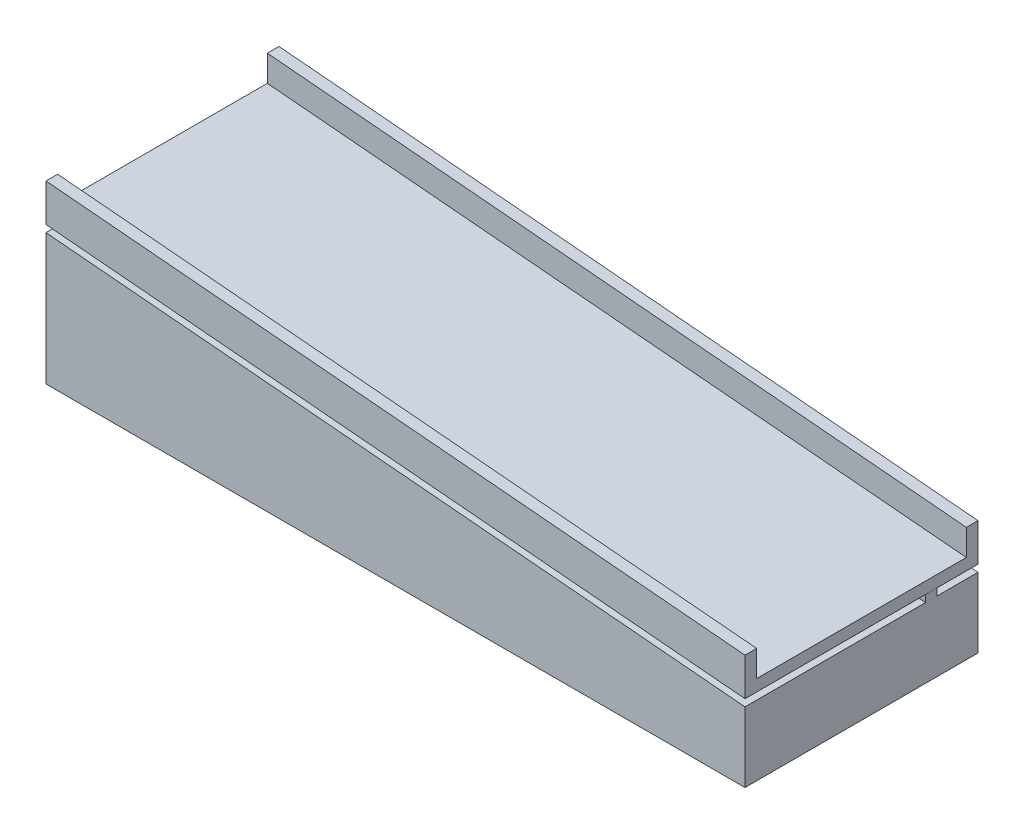
ISO-10303-21;
HEADER;
FILE_DESCRIPTION(('STEP AP214'),'2;1');
FILE_NAME('part.step','',(''),(''),'','','');
FILE_SCHEMA(('AUTOMOTIVE_DESIGN { 1 0 10303 214 1 1 1 1 }'));
ENDSEC;
DATA;
#1=APPLICATION_CONTEXT('core data for automotive mechanical design processes');
#2=APPLICATION_PROTOCOL_DEFINITION('international standard','automotive_design',2000,#1);
#3=PRODUCT_CONTEXT('',#1,'mechanical');
#4=PRODUCT('Part','Part','',(#3));
#5=PRODUCT_RELATED_PRODUCT_CATEGORY('part','',(#4));
#6=PRODUCT_DEFINITION_FORMATION('','',#4);
#7=PRODUCT_DEFINITION_CONTEXT('part definition',#1,'design');
#8=PRODUCT_DEFINITION('design','',#6,#7);
#9=PRODUCT_DEFINITION_SHAPE('','',#8);
#10=(LENGTH_UNIT() NAMED_UNIT(*) SI_UNIT(.MILLI.,.METRE.));
#11=(NAMED_UNIT(*) PLANE_ANGLE_UNIT() SI_UNIT($,.RADIAN.));
#12=(NAMED_UNIT(*) SI_UNIT($,.STERADIAN.) SOLID_ANGLE_UNIT());
#13=UNCERTAINTY_MEASURE_WITH_UNIT(LENGTH_MEASURE(1.E-05),#10,'distance_accuracy_value','');
#14=(GEOMETRIC_REPRESENTATION_CONTEXT(3) GLOBAL_UNCERTAINTY_ASSIGNED_CONTEXT((#13)) GLOBAL_UNIT_ASSIGNED_CONTEXT((#10,
#11,#12)) REPRESENTATION_CONTEXT('',''));
#15=CARTESIAN_POINT('',(0.,0.,0.));
#16=DIRECTION('',(0.,0.,1.));
#17=DIRECTION('',(1.,0.,0.));
#18=AXIS2_PLACEMENT_3D('',#15,#16,#17);
#19=CARTESIAN_POINT('',(0.,0.,0.));
#20=DIRECTION('',(1.,0.,0.));
#21=DIRECTION('',(0.,0.,-1.));
#22=AXIS2_PLACEMENT_3D('',#19,#20,#21);
#23=PLANE('',#22);
#24=DIRECTION('',(0.,-1.,0.));
#25=VECTOR('',#24,1.);
#26=CARTESIAN_POINT('',(0.,59.2577659597685,0.));
#27=LINE('',#26,#25);
#28=CARTESIAN_POINT('',(0.,75.4577060547774,0.));
#29=VERTEX_POINT('',#28);
#30=CARTESIAN_POINT('',(0.,59.2577659597685,0.));
#31=VERTEX_POINT('',#30);
#32=EDGE_CURVE('E84',#29,#31,#27,.T.);
#33=ORIENTED_EDGE('',*,*,#32,.T.);
#34=DIRECTION('',(0.,0.,1.));
#35=VECTOR('',#34,1.);
#36=CARTESIAN_POINT('',(0.,59.2577659597685,0.));
#37=LINE('',#36,#35);
#38=CARTESIAN_POINT('',(0.,59.2577659597685,100.));
#39=VERTEX_POINT('',#38);
#40=EDGE_CURVE('E78',#31,#39,#37,.T.);
#41=ORIENTED_EDGE('',*,*,#40,.T.);
#42=DIRECTION('',(0.,1.,0.));
#43=VECTOR('',#42,1.);
#44=CARTESIAN_POINT('',(0.,59.2577659597685,100.));
#45=LINE('',#44,#43);
#46=CARTESIAN_POINT('',(0.,75.4577060547774,100.));
#47=VERTEX_POINT('',#46);
#48=EDGE_CURVE('E119',#39,#47,#45,.T.);
#49=ORIENTED_EDGE('',*,*,#48,.T.);
#50=DIRECTION('',(0.,0.,-1.));
#51=VECTOR('',#50,1.);
#52=CARTESIAN_POINT('',(0.,75.4577060547774,95.));
#53=LINE('',#52,#51);
#54=CARTESIAN_POINT('',(0.,75.4577060547774,95.));
#55=VERTEX_POINT('',#54);
#56=EDGE_CURVE('E126',#47,#55,#53,.T.);
#57=ORIENTED_EDGE('',*,*,#56,.T.);
#58=DIRECTION('',(0.,-1.,0.));
#59=VECTOR('',#58,1.);
#60=CARTESIAN_POINT('',(0.,75.4577060547774,95.));
#61=LINE('',#60,#59);
#62=CARTESIAN_POINT('',(0.,64.2577659597685,95.));
#63=VERTEX_POINT('',#62);
#64=EDGE_CURVE('E136',#55,#63,#61,.T.);
#65=ORIENTED_EDGE('',*,*,#64,.T.);
#66=DIRECTION('',(0.,0.,-1.));
#67=VECTOR('',#66,1.);
#68=CARTESIAN_POINT('',(0.,64.2577659597685,5.));
#69=LINE('',#68,#67);
#70=CARTESIAN_POINT('',(0.,64.2577659597685,5.));
#71=VERTEX_POINT('',#70);
#72=EDGE_CURVE('E145',#63,#71,#69,.T.);
#73=ORIENTED_EDGE('',*,*,#72,.T.);
#74=DIRECTION('',(0.,1.,0.));
#75=VECTOR('',#74,1.);
#76=CARTESIAN_POINT('',(0.,75.4577060547774,5.));
#77=LINE('',#76,#75);
#78=CARTESIAN_POINT('',(0.,75.4577060547774,5.));
#79=VERTEX_POINT('',#78);
#80=EDGE_CURVE('E153',#71,#79,#77,.T.);
#81=ORIENTED_EDGE('',*,*,#80,.T.);
#82=DIRECTION('',(0.,0.,-1.));
#83=VECTOR('',#82,1.);
#84=CARTESIAN_POINT('',(0.,75.4577060547774,0.));
#85=LINE('',#84,#83);
#86=EDGE_CURVE('E89',#79,#29,#85,.T.);
#87=ORIENTED_EDGE('',*,*,#86,.T.);
#88=EDGE_LOOP('',(#33,#41,#49,#57,#65,#73,#81,#87));
#89=FACE_BOUND('',#88,.T.);
#90=ADVANCED_FACE('F42',(#89),#23,.F.);
#91=CARTESIAN_POINT('',(300.,-26.246599057775,0.));
#92=DIRECTION('',(1.,0.,0.));
#93=DIRECTION('',(0.,0.,-1.));
#94=AXIS2_PLACEMENT_3D('',#91,#92,#93);
#95=PLANE('',#94);
#96=DIRECTION('',(0.,-1.,0.));
#97=VECTOR('',#96,1.);
#98=CARTESIAN_POINT('',(300.,33.0111669019935,0.));
#99=LINE('',#98,#97);
#100=CARTESIAN_POINT('',(300.,49.2111069970024,0.));
#101=VERTEX_POINT('',#100);
#102=CARTESIAN_POINT('',(300.,33.0111669019935,0.));
#103=VERTEX_POINT('',#102);
#104=EDGE_CURVE('E56',#101,#103,#99,.T.);
#105=ORIENTED_EDGE('',*,*,#104,.F.);
#106=DIRECTION('',(0.,0.,-1.));
#107=VECTOR('',#106,1.);
#108=CARTESIAN_POINT('',(300.,49.2111069970024,0.));
#109=LINE('',#108,#107);
#110=CARTESIAN_POINT('',(300.,49.2111069970024,5.));
#111=VERTEX_POINT('',#110);
#112=EDGE_CURVE('E65',#111,#101,#109,.T.);
#113=ORIENTED_EDGE('',*,*,#112,.F.);
#114=DIRECTION('',(0.,1.,0.));
#115=VECTOR('',#114,1.);
#116=CARTESIAN_POINT('',(300.,49.2111069970024,5.));
#117=LINE('',#116,#115);
#118=CARTESIAN_POINT('',(300.,38.0111669019935,5.));
#119=VERTEX_POINT('',#118);
#120=EDGE_CURVE('E158',#119,#111,#117,.T.);
#121=ORIENTED_EDGE('',*,*,#120,.F.);
#122=DIRECTION('',(0.,0.,-1.));
#123=VECTOR('',#122,1.);
#124=CARTESIAN_POINT('',(300.,38.0111669019935,5.));
#125=LINE('',#124,#123);
#126=CARTESIAN_POINT('',(300.,38.0111669019935,95.));
#127=VERTEX_POINT('',#126);
#128=EDGE_CURVE('E150',#127,#119,#125,.T.);
#129=ORIENTED_EDGE('',*,*,#128,.F.);
#130=DIRECTION('',(0.,-1.,0.));
#131=VECTOR('',#130,1.);
#132=CARTESIAN_POINT('',(300.,49.2111069970024,95.));
#133=LINE('',#132,#131);
#134=CARTESIAN_POINT('',(300.,49.2111069970024,95.));
#135=VERTEX_POINT('',#134);
#136=EDGE_CURVE('E142',#135,#127,#133,.T.);
#137=ORIENTED_EDGE('',*,*,#136,.F.);
#138=DIRECTION('',(0.,0.,-1.));
#139=VECTOR('',#138,1.);
#140=CARTESIAN_POINT('',(300.,49.2111069970024,95.));
#141=LINE('',#140,#139);
#142=CARTESIAN_POINT('',(300.,49.2111069970024,100.));
#143=VERTEX_POINT('',#142);
#144=EDGE_CURVE('E137',#143,#135,#141,.T.);
#145=ORIENTED_EDGE('',*,*,#144,.F.);
#146=DIRECTION('',(0.,1.,0.));
#147=VECTOR('',#146,1.);
#148=CARTESIAN_POINT('',(300.,33.0111669019935,100.));
#149=LINE('',#148,#147);
#150=CARTESIAN_POINT('',(300.,33.0111669019935,100.));
#151=VERTEX_POINT('',#150);
#152=EDGE_CURVE('E130',#151,#143,#149,.T.);
#153=ORIENTED_EDGE('',*,*,#152,.F.);
#154=DIRECTION('',(0.,0.,1.));
#155=VECTOR('',#154,1.);
#156=CARTESIAN_POINT('',(300.,33.0111669019935,0.));
#157=LINE('',#156,#155);
#158=EDGE_CURVE('E12',#103,#151,#157,.T.);
#159=ORIENTED_EDGE('',*,*,#158,.F.);
#160=EDGE_LOOP('',(#105,#113,#121,#129,#137,#145,#153,#159));
#161=FACE_BOUND('',#160,.T.);
#162=ADVANCED_FACE('F181',(#161),#95,.T.);
#163=CARTESIAN_POINT('',(0.,59.2577659597685,100.));
#164=DIRECTION('',(0.,0.,-1.));
#165=DIRECTION('',(-1.,0.,0.));
#166=AXIS2_PLACEMENT_3D('',#163,#164,#165);
#167=PLANE('',#166);
#168=DIRECTION('',(0.996194698091746,-0.0871557427476511,0.));
#169=VECTOR('',#168,1.);
#170=CARTESIAN_POINT('',(0.,75.4577060547774,100.));
#171=LINE('',#170,#169);
#172=EDGE_CURVE('E123',#47,#143,#171,.T.);
#173=ORIENTED_EDGE('',*,*,#172,.F.);
#174=ORIENTED_EDGE('',*,*,#48,.F.);
#175=DIRECTION('',(0.996194698091746,-0.0871557427476511,0.));
#176=VECTOR('',#175,1.);
#177=CARTESIAN_POINT('',(0.,59.2577659597685,100.));
#178=LINE('',#177,#176);
#179=EDGE_CURVE('E121',#39,#151,#178,.T.);
#180=ORIENTED_EDGE('',*,*,#179,.T.);
#181=ORIENTED_EDGE('',*,*,#152,.T.);
#182=EDGE_LOOP('',(#173,#174,#180,#181));
#183=FACE_BOUND('',#182,.T.);
#184=ADVANCED_FACE('F120',(#183),#167,.F.);
#185=CARTESIAN_POINT('',(0.,75.4577060547774,95.));
#186=DIRECTION('',(-0.0871557427476511,-0.996194698091746,0.));
#187=DIRECTION('',(0.996194698091746,-0.0871557427476511,0.));
#188=AXIS2_PLACEMENT_3D('',#185,#186,#187);
#189=PLANE('',#188);
#190=DIRECTION('',(0.996194698091746,-0.0871557427476511,0.));
#191=VECTOR('',#190,1.);
#192=CARTESIAN_POINT('',(0.,75.4577060547774,95.));
#193=LINE('',#192,#191);
#194=EDGE_CURVE('E139',#55,#135,#193,.T.);
#195=ORIENTED_EDGE('',*,*,#194,.F.);
#196=ORIENTED_EDGE('',*,*,#56,.F.);
#197=ORIENTED_EDGE('',*,*,#172,.T.);
#198=ORIENTED_EDGE('',*,*,#144,.T.);
#199=EDGE_LOOP('',(#195,#196,#197,#198));
#200=FACE_BOUND('',#199,.T.);
#201=ADVANCED_FACE('F188',(#200),#189,.F.);
#202=CARTESIAN_POINT('',(0.,75.4577060547774,95.));
#203=DIRECTION('',(0.,0.,1.));
#204=DIRECTION('',(1.,0.,0.));
#205=AXIS2_PLACEMENT_3D('',#202,#203,#204);
#206=PLANE('',#205);
#207=DIRECTION('',(0.996194698091746,-0.0871557427476511,0.));
#208=VECTOR('',#207,1.);
#209=CARTESIAN_POINT('',(0.,64.2577659597685,95.));
#210=LINE('',#209,#208);
#211=EDGE_CURVE('E147',#63,#127,#210,.T.);
#212=ORIENTED_EDGE('',*,*,#211,.F.);
#213=ORIENTED_EDGE('',*,*,#64,.F.);
#214=ORIENTED_EDGE('',*,*,#194,.T.);
#215=ORIENTED_EDGE('',*,*,#136,.T.);
#216=EDGE_LOOP('',(#212,#213,#214,#215));
#217=FACE_BOUND('',#216,.T.);
#218=ADVANCED_FACE('F199',(#217),#206,.F.);
#219=CARTESIAN_POINT('',(0.,64.2577659597685,5.));
#220=DIRECTION('',(-0.0871557427476511,-0.996194698091746,0.));
#221=DIRECTION('',(0.996194698091746,-0.0871557427476511,0.));
#222=AXIS2_PLACEMENT_3D('',#219,#220,#221);
#223=PLANE('',#222);
#224=DIRECTION('',(0.996194698091746,-0.0871557427476511,0.));
#225=VECTOR('',#224,1.);
#226=CARTESIAN_POINT('',(0.,64.2577659597685,5.));
#227=LINE('',#226,#225);
#228=EDGE_CURVE('E155',#71,#119,#227,.T.);
#229=ORIENTED_EDGE('',*,*,#228,.F.);
#230=ORIENTED_EDGE('',*,*,#72,.F.);
#231=ORIENTED_EDGE('',*,*,#211,.T.);
#232=ORIENTED_EDGE('',*,*,#128,.T.);
#233=EDGE_LOOP('',(#229,#230,#231,#232));
#234=FACE_BOUND('',#233,.T.);
#235=ADVANCED_FACE('F201',(#234),#223,.F.);
#236=CARTESIAN_POINT('',(0.,75.4577060547774,5.));
#237=DIRECTION('',(0.,0.,-1.));
#238=DIRECTION('',(-1.,0.,0.));
#239=AXIS2_PLACEMENT_3D('',#236,#237,#238);
#240=PLANE('',#239);
#241=DIRECTION('',(0.996194698091746,-0.0871557427476511,0.));
#242=VECTOR('',#241,1.);
#243=CARTESIAN_POINT('',(0.,75.4577060547774,5.));
#244=LINE('',#243,#242);
#245=EDGE_CURVE('E161',#79,#111,#244,.T.);
#246=ORIENTED_EDGE('',*,*,#245,.F.);
#247=ORIENTED_EDGE('',*,*,#80,.F.);
#248=ORIENTED_EDGE('',*,*,#228,.T.);
#249=ORIENTED_EDGE('',*,*,#120,.T.);
#250=EDGE_LOOP('',(#246,#247,#248,#249));
#251=FACE_BOUND('',#250,.T.);
#252=ADVANCED_FACE('F178',(#251),#240,.F.);
#253=CARTESIAN_POINT('',(0.,75.4577060547774,0.));
#254=DIRECTION('',(-0.0871557427476511,-0.996194698091746,0.));
#255=DIRECTION('',(0.996194698091746,-0.0871557427476511,0.));
#256=AXIS2_PLACEMENT_3D('',#253,#254,#255);
#257=PLANE('',#256);
#258=DIRECTION('',(0.996194698091746,-0.0871557427476511,0.));
#259=VECTOR('',#258,1.);
#260=CARTESIAN_POINT('',(0.,75.4577060547774,0.));
#261=LINE('',#260,#259);
#262=EDGE_CURVE('E165',#29,#101,#261,.T.);
#263=ORIENTED_EDGE('',*,*,#262,.F.);
#264=ORIENTED_EDGE('',*,*,#86,.F.);
#265=ORIENTED_EDGE('',*,*,#245,.T.);
#266=ORIENTED_EDGE('',*,*,#112,.T.);
#267=EDGE_LOOP('',(#263,#264,#265,#266));
#268=FACE_BOUND('',#267,.T.);
#269=ADVANCED_FACE('F171',(#268),#257,.F.);
#270=CARTESIAN_POINT('',(0.,59.2577659597685,0.));
#271=DIRECTION('',(0.,0.,1.));
#272=DIRECTION('',(1.,0.,0.));
#273=AXIS2_PLACEMENT_3D('',#270,#271,#272);
#274=PLANE('',#273);
#275=DIRECTION('',(0.996194698091746,-0.0871557427476511,0.));
#276=VECTOR('',#275,1.);
#277=CARTESIAN_POINT('',(0.,59.2577659597685,0.));
#278=LINE('',#277,#276);
#279=EDGE_CURVE('E49',#31,#103,#278,.T.);
#280=ORIENTED_EDGE('',*,*,#279,.F.);
#281=ORIENTED_EDGE('',*,*,#32,.F.);
#282=ORIENTED_EDGE('',*,*,#262,.T.);
#283=ORIENTED_EDGE('',*,*,#104,.T.);
#284=EDGE_LOOP('',(#280,#281,#282,#283));
#285=FACE_BOUND('',#284,.T.);
#286=ADVANCED_FACE('F169',(#285),#274,.F.);
#287=CARTESIAN_POINT('',(0.,59.2577659597685,0.));
#288=DIRECTION('',(0.0871557427476511,0.996194698091746,0.));
#289=DIRECTION('',(-0.996194698091746,0.0871557427476511,0.));
#290=AXIS2_PLACEMENT_3D('',#287,#288,#289);
#291=PLANE('',#290);
#292=ORIENTED_EDGE('',*,*,#158,.T.);
#293=ORIENTED_EDGE('',*,*,#179,.F.);
#294=ORIENTED_EDGE('',*,*,#40,.F.);
#295=ORIENTED_EDGE('',*,*,#279,.T.);
#296=EDGE_LOOP('',(#292,#293,#294,#295));
#297=FACE_BOUND('',#296,.T.);
#298=ADVANCED_FACE('F128',(#297),#291,.F.);
#299=CLOSED_SHELL('',(#90,#162,#184,#201,#218,#235,#252,#269,#286,#298));
#300=MANIFOLD_SOLID_BREP('B2',#299);
#301=CARTESIAN_POINT('',(0.,56.2465990577751,100.));
#302=DIRECTION('',(-0.0871557427476512,-0.996194698091746,0.));
#303=DIRECTION('',(0.996194698091746,-0.0871557427476512,0.));
#304=AXIS2_PLACEMENT_3D('',#301,#302,#303);
#305=PLANE('',#304);
#306=DIRECTION('',(0.996194698091746,-0.0871557427476512,0.));
#307=VECTOR('',#306,1.);
#308=CARTESIAN_POINT('',(0.,56.2465990577751,17.5));
#309=LINE('',#308,#307);
#310=CARTESIAN_POINT('',(0.,56.2465990577751,17.5));
#311=VERTEX_POINT('',#310);
#312=CARTESIAN_POINT('',(300.,30.,17.5));
#313=VERTEX_POINT('',#312);
#314=EDGE_CURVE('E391',#311,#313,#309,.T.);
#315=ORIENTED_EDGE('',*,*,#314,.T.);
#316=DIRECTION('',(0.,0.,-1.));
#317=VECTOR('',#316,1.);
#318=CARTESIAN_POINT('',(300.,30.,100.));
#319=LINE('',#318,#317);
#320=CARTESIAN_POINT('',(300.,30.,0.));
#321=VERTEX_POINT('',#320);
#322=EDGE_CURVE('E361',#313,#321,#319,.T.);
#323=ORIENTED_EDGE('',*,*,#322,.T.);
#324=DIRECTION('',(-0.996194698091746,0.0871557427476512,0.));
#325=VECTOR('',#324,1.);
#326=CARTESIAN_POINT('',(0.,56.2465990577751,0.));
#327=LINE('',#326,#325);
#328=CARTESIAN_POINT('',(0.,56.2465990577751,0.));
#329=VERTEX_POINT('',#328);
#330=EDGE_CURVE('E369',#321,#329,#327,.T.);
#331=ORIENTED_EDGE('',*,*,#330,.T.);
#332=DIRECTION('',(0.,0.,-1.));
#333=VECTOR('',#332,1.);
#334=CARTESIAN_POINT('',(0.,56.2465990577751,100.));
#335=LINE('',#334,#333);
#336=EDGE_CURVE('E362',#311,#329,#335,.T.);
#337=ORIENTED_EDGE('',*,*,#336,.F.);
#338=EDGE_LOOP('',(#315,#323,#331,#337));
#339=FACE_BOUND('',#338,.T.);
#340=ADVANCED_FACE('F269',(#339),#305,.F.);
#341=CARTESIAN_POINT('',(300.,0.,100.));
#342=DIRECTION('',(0.,1.,0.));
#343=DIRECTION('',(-1.,0.,0.));
#344=AXIS2_PLACEMENT_3D('',#341,#342,#343);
#345=PLANE('',#344);
#346=DIRECTION('',(1.,0.,0.));
#347=VECTOR('',#346,1.);
#348=CARTESIAN_POINT('',(300.,0.,0.));
#349=LINE('',#348,#347);
#350=CARTESIAN_POINT('',(0.,0.,0.));
#351=VERTEX_POINT('',#350);
#352=CARTESIAN_POINT('',(300.,0.,0.));
#353=VERTEX_POINT('',#352);
#354=EDGE_CURVE('E375',#351,#353,#349,.T.);
#355=ORIENTED_EDGE('',*,*,#354,.T.);
#356=DIRECTION('',(0.,0.,-1.));
#357=VECTOR('',#356,1.);
#358=CARTESIAN_POINT('',(300.,0.,100.));
#359=LINE('',#358,#357);
#360=CARTESIAN_POINT('',(300.,0.,100.));
#361=VERTEX_POINT('',#360);
#362=EDGE_CURVE('E40',#361,#353,#359,.T.);
#363=ORIENTED_EDGE('',*,*,#362,.F.);
#364=DIRECTION('',(1.,0.,0.));
#365=VECTOR('',#364,1.);
#366=CARTESIAN_POINT('',(300.,0.,100.));
#367=LINE('',#366,#365);
#368=CARTESIAN_POINT('',(0.,0.,100.));
#369=VERTEX_POINT('',#368);
#370=EDGE_CURVE('E368',#369,#361,#367,.T.);
#371=ORIENTED_EDGE('',*,*,#370,.F.);
#372=DIRECTION('',(0.,0.,-1.));
#373=VECTOR('',#372,1.);
#374=CARTESIAN_POINT('',(0.,0.,100.));
#375=LINE('',#374,#373);
#376=EDGE_CURVE('E364',#369,#351,#375,.T.);
#377=ORIENTED_EDGE('',*,*,#376,.T.);
#378=EDGE_LOOP('',(#355,#363,#371,#377));
#379=FACE_BOUND('',#378,.T.);
#380=ADVANCED_FACE('F271',(#379),#345,.F.);
#381=CARTESIAN_POINT('',(300.,30.,100.));
#382=DIRECTION('',(-1.,0.,0.));
#383=DIRECTION('',(0.,0.,1.));
#384=AXIS2_PLACEMENT_3D('',#381,#382,#383);
#385=PLANE('',#384);
#386=DIRECTION('',(0.,1.,0.));
#387=VECTOR('',#386,1.);
#388=CARTESIAN_POINT('',(300.,30.,0.));
#389=LINE('',#388,#387);
#390=EDGE_CURVE('E372',#353,#321,#389,.T.);
#391=ORIENTED_EDGE('',*,*,#390,.T.);
#392=ORIENTED_EDGE('',*,*,#322,.F.);
#393=DIRECTION('',(0.,1.,0.));
#394=VECTOR('',#393,1.);
#395=CARTESIAN_POINT('',(300.,30.,17.5));
#396=LINE('',#395,#394);
#397=CARTESIAN_POINT('',(300.,33.,17.5));
#398=VERTEX_POINT('',#397);
#399=EDGE_CURVE('E389',#313,#398,#396,.T.);
#400=ORIENTED_EDGE('',*,*,#399,.T.);
#401=DIRECTION('',(0.,0.,-1.));
#402=VECTOR('',#401,1.);
#403=CARTESIAN_POINT('',(300.,33.,22.5));
#404=LINE('',#403,#402);
#405=CARTESIAN_POINT('',(300.,33.,22.5));
#406=VERTEX_POINT('',#405);
#407=EDGE_CURVE('E378',#406,#398,#404,.T.);
#408=ORIENTED_EDGE('',*,*,#407,.F.);
#409=DIRECTION('',(0.,1.,0.));
#410=VECTOR('',#409,1.);
#411=CARTESIAN_POINT('',(300.,30.,22.5));
#412=LINE('',#411,#410);
#413=CARTESIAN_POINT('',(300.,30.,22.5));
#414=VERTEX_POINT('',#413);
#415=EDGE_CURVE('E358',#414,#406,#412,.T.);
#416=ORIENTED_EDGE('',*,*,#415,.F.);
#417=CARTESIAN_POINT('',(300.,30.,100.));
#418=VERTEX_POINT('',#417);
#419=EDGE_CURVE('E277',#418,#414,#319,.T.);
#420=ORIENTED_EDGE('',*,*,#419,.F.);
#421=DIRECTION('',(0.,1.,0.));
#422=VECTOR('',#421,1.);
#423=CARTESIAN_POINT('',(300.,30.,100.));
#424=LINE('',#423,#422);
#425=EDGE_CURVE('E318',#361,#418,#424,.T.);
#426=ORIENTED_EDGE('',*,*,#425,.F.);
#427=ORIENTED_EDGE('',*,*,#362,.T.);
#428=EDGE_LOOP('',(#391,#392,#400,#408,#416,#420,#426,#427));
#429=FACE_BOUND('',#428,.T.);
#430=ADVANCED_FACE('F397',(#429),#385,.F.);
#431=ORIENTED_EDGE('',*,*,#419,.T.);
#432=DIRECTION('',(0.996194698091746,-0.0871557427476512,0.));
#433=VECTOR('',#432,1.);
#434=CARTESIAN_POINT('',(0.,56.2465990577751,22.5));
#435=LINE('',#434,#433);
#436=CARTESIAN_POINT('',(0.,56.2465990577751,22.5));
#437=VERTEX_POINT('',#436);
#438=EDGE_CURVE('E344',#437,#414,#435,.T.);
#439=ORIENTED_EDGE('',*,*,#438,.F.);
#440=CARTESIAN_POINT('',(0.,56.2465990577751,100.));
#441=VERTEX_POINT('',#440);
#442=EDGE_CURVE('E357',#441,#437,#335,.T.);
#443=ORIENTED_EDGE('',*,*,#442,.F.);
#444=DIRECTION('',(-0.996194698091746,0.0871557427476512,0.));
#445=VECTOR('',#444,1.);
#446=CARTESIAN_POINT('',(0.,56.2465990577751,100.));
#447=LINE('',#446,#445);
#448=EDGE_CURVE('E380',#418,#441,#447,.T.);
#449=ORIENTED_EDGE('',*,*,#448,.F.);
#450=EDGE_LOOP('',(#431,#439,#443,#449));
#451=FACE_BOUND('',#450,.T.);
#452=ADVANCED_FACE('F355',(#451),#305,.F.);
#453=CARTESIAN_POINT('',(0.,0.,100.));
#454=DIRECTION('',(1.,0.,0.));
#455=DIRECTION('',(0.,1.,0.));
#456=AXIS2_PLACEMENT_3D('',#453,#454,#455);
#457=PLANE('',#456);
#458=DIRECTION('',(0.,-1.,0.));
#459=VECTOR('',#458,1.);
#460=CARTESIAN_POINT('',(0.,0.,0.));
#461=LINE('',#460,#459);
#462=EDGE_CURVE('E311',#329,#351,#461,.T.);
#463=ORIENTED_EDGE('',*,*,#462,.T.);
#464=ORIENTED_EDGE('',*,*,#376,.F.);
#465=DIRECTION('',(0.,-1.,0.));
#466=VECTOR('',#465,1.);
#467=CARTESIAN_POINT('',(0.,0.,100.));
#468=LINE('',#467,#466);
#469=EDGE_CURVE('E293',#441,#369,#468,.T.);
#470=ORIENTED_EDGE('',*,*,#469,.F.);
#471=ORIENTED_EDGE('',*,*,#442,.T.);
#472=DIRECTION('',(0.,-1.,0.));
#473=VECTOR('',#472,1.);
#474=CARTESIAN_POINT('',(0.,59.246599057775,22.5));
#475=LINE('',#474,#473);
#476=CARTESIAN_POINT('',(0.,59.246599057775,22.5));
#477=VERTEX_POINT('',#476);
#478=EDGE_CURVE('E341',#477,#437,#475,.T.);
#479=ORIENTED_EDGE('',*,*,#478,.F.);
#480=DIRECTION('',(0.,0.,-1.));
#481=VECTOR('',#480,1.);
#482=CARTESIAN_POINT('',(0.,59.246599057775,22.5));
#483=LINE('',#482,#481);
#484=CARTESIAN_POINT('',(0.,59.246599057775,17.5));
#485=VERTEX_POINT('',#484);
#486=EDGE_CURVE('E386',#477,#485,#483,.T.);
#487=ORIENTED_EDGE('',*,*,#486,.T.);
#488=DIRECTION('',(0.,-1.,0.));
#489=VECTOR('',#488,1.);
#490=CARTESIAN_POINT('',(0.,59.246599057775,17.5));
#491=LINE('',#490,#489);
#492=EDGE_CURVE('E284',#485,#311,#491,.T.);
#493=ORIENTED_EDGE('',*,*,#492,.T.);
#494=ORIENTED_EDGE('',*,*,#336,.T.);
#495=EDGE_LOOP('',(#463,#464,#470,#471,#479,#487,#493,#494));
#496=FACE_BOUND('',#495,.T.);
#497=ADVANCED_FACE('F360',(#496),#457,.F.);
#498=CARTESIAN_POINT('',(0.,0.,100.));
#499=DIRECTION('',(0.,0.,-1.));
#500=DIRECTION('',(-1.,0.,0.));
#501=AXIS2_PLACEMENT_3D('',#498,#499,#500);
#502=PLANE('',#501);
#503=ORIENTED_EDGE('',*,*,#370,.T.);
#504=ORIENTED_EDGE('',*,*,#425,.T.);
#505=ORIENTED_EDGE('',*,*,#448,.T.);
#506=ORIENTED_EDGE('',*,*,#469,.T.);
#507=EDGE_LOOP('',(#503,#504,#505,#506));
#508=FACE_BOUND('',#507,.T.);
#509=ADVANCED_FACE('F413',(#508),#502,.F.);
#510=CARTESIAN_POINT('',(0.,0.,0.));
#511=DIRECTION('',(0.,0.,-1.));
#512=DIRECTION('',(-1.,0.,0.));
#513=AXIS2_PLACEMENT_3D('',#510,#511,#512);
#514=PLANE('',#513);
#515=ORIENTED_EDGE('',*,*,#354,.F.);
#516=ORIENTED_EDGE('',*,*,#462,.F.);
#517=ORIENTED_EDGE('',*,*,#330,.F.);
#518=ORIENTED_EDGE('',*,*,#390,.F.);
#519=EDGE_LOOP('',(#515,#516,#517,#518));
#520=FACE_BOUND('',#519,.T.);
#521=ADVANCED_FACE('F409',(#520),#514,.T.);
#522=CARTESIAN_POINT('',(300.,33.,22.5));
#523=DIRECTION('',(-0.0871557427476511,-0.996194698091746,0.));
#524=DIRECTION('',(0.996194698091746,-0.0871557427476511,0.));
#525=AXIS2_PLACEMENT_3D('',#522,#523,#524);
#526=PLANE('',#525);
#527=DIRECTION('',(-0.996194698091746,0.0871557427476511,0.));
#528=VECTOR('',#527,1.);
#529=CARTESIAN_POINT('',(300.,33.,17.5));
#530=LINE('',#529,#528);
#531=EDGE_CURVE('E350',#398,#485,#530,.T.);
#532=ORIENTED_EDGE('',*,*,#531,.T.);
#533=ORIENTED_EDGE('',*,*,#486,.F.);
#534=DIRECTION('',(-0.996194698091746,0.0871557427476511,0.));
#535=VECTOR('',#534,1.);
#536=CARTESIAN_POINT('',(300.,33.,22.5));
#537=LINE('',#536,#535);
#538=EDGE_CURVE('E347',#406,#477,#537,.T.);
#539=ORIENTED_EDGE('',*,*,#538,.F.);
#540=ORIENTED_EDGE('',*,*,#407,.T.);
#541=EDGE_LOOP('',(#532,#533,#539,#540));
#542=FACE_BOUND('',#541,.T.);
#543=ADVANCED_FACE('F401',(#542),#526,.F.);
#544=CARTESIAN_POINT('',(0.,0.,22.5));
#545=DIRECTION('',(0.,0.,1.));
#546=DIRECTION('',(1.,0.,0.));
#547=AXIS2_PLACEMENT_3D('',#544,#545,#546);
#548=PLANE('',#547);
#549=ORIENTED_EDGE('',*,*,#478,.T.);
#550=ORIENTED_EDGE('',*,*,#438,.T.);
#551=ORIENTED_EDGE('',*,*,#415,.T.);
#552=ORIENTED_EDGE('',*,*,#538,.T.);
#553=EDGE_LOOP('',(#549,#550,#551,#552));
#554=FACE_BOUND('',#553,.T.);
#555=ADVANCED_FACE('F343',(#554),#548,.T.);
#556=CARTESIAN_POINT('',(0.,0.,17.5));
#557=DIRECTION('',(0.,0.,1.));
#558=DIRECTION('',(1.,0.,0.));
#559=AXIS2_PLACEMENT_3D('',#556,#557,#558);
#560=PLANE('',#559);
#561=ORIENTED_EDGE('',*,*,#492,.F.);
#562=ORIENTED_EDGE('',*,*,#531,.F.);
#563=ORIENTED_EDGE('',*,*,#399,.F.);
#564=ORIENTED_EDGE('',*,*,#314,.F.);
#565=EDGE_LOOP('',(#561,#562,#563,#564));
#566=FACE_BOUND('',#565,.T.);
#567=ADVANCED_FACE('F403',(#566),#560,.F.);
#568=CLOSED_SHELL('',(#340,#380,#430,#452,#497,#509,#521,#543,#555,#567));
#569=MANIFOLD_SOLID_BREP('B6',#568);
#570=ADVANCED_BREP_SHAPE_REPRESENTATION('',(#18,#300,#569),#14);
#571=SHAPE_DEFINITION_REPRESENTATION(#9,#570);
ENDSEC;
END-ISO-10303-21;
